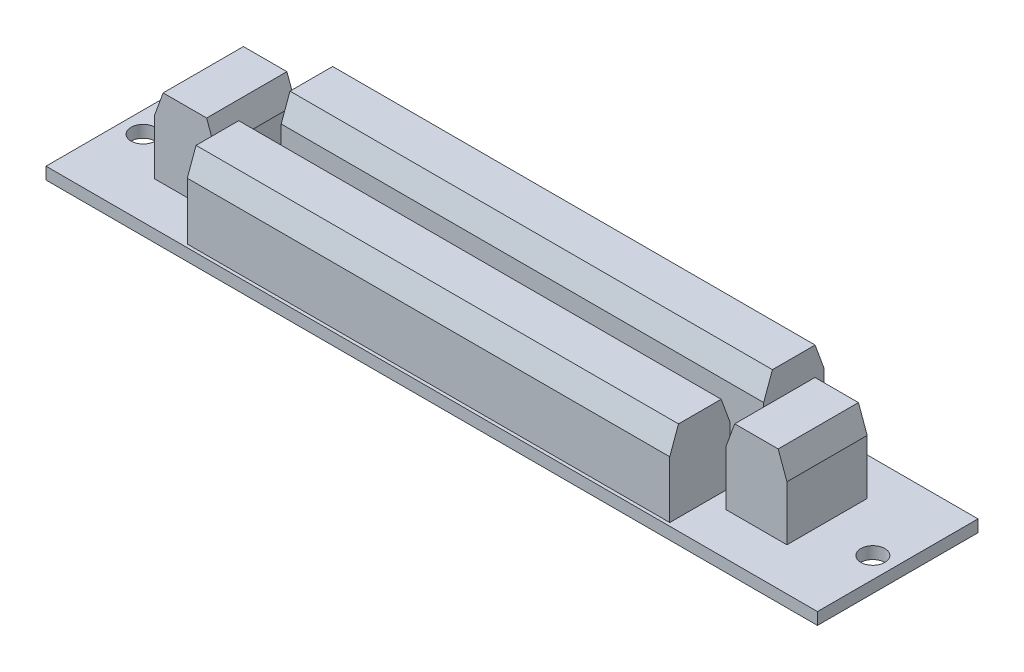
ISO-10303-21;
HEADER;
FILE_DESCRIPTION(('STEP AP214'),'2;1');
FILE_NAME('part.step','',(''),(''),'','','');
FILE_SCHEMA(('AUTOMOTIVE_DESIGN { 1 0 10303 214 1 1 1 1 }'));
ENDSEC;
DATA;
#1=APPLICATION_CONTEXT('core data for automotive mechanical design processes');
#2=APPLICATION_PROTOCOL_DEFINITION('international standard','automotive_design',2000,#1);
#3=PRODUCT_CONTEXT('',#1,'mechanical');
#4=PRODUCT('Part','Part','',(#3));
#5=PRODUCT_RELATED_PRODUCT_CATEGORY('part','',(#4));
#6=PRODUCT_DEFINITION_FORMATION('','',#4);
#7=PRODUCT_DEFINITION_CONTEXT('part definition',#1,'design');
#8=PRODUCT_DEFINITION('design','',#6,#7);
#9=PRODUCT_DEFINITION_SHAPE('','',#8);
#10=(LENGTH_UNIT() NAMED_UNIT(*) SI_UNIT(.MILLI.,.METRE.));
#11=(NAMED_UNIT(*) PLANE_ANGLE_UNIT() SI_UNIT($,.RADIAN.));
#12=(NAMED_UNIT(*) SI_UNIT($,.STERADIAN.) SOLID_ANGLE_UNIT());
#13=UNCERTAINTY_MEASURE_WITH_UNIT(LENGTH_MEASURE(1.E-05),#10,'distance_accuracy_value','');
#14=(GEOMETRIC_REPRESENTATION_CONTEXT(3) GLOBAL_UNCERTAINTY_ASSIGNED_CONTEXT((#13)) GLOBAL_UNIT_ASSIGNED_CONTEXT((#10,
#11,#12)) REPRESENTATION_CONTEXT('',''));
#15=CARTESIAN_POINT('',(0.,0.,0.));
#16=DIRECTION('',(0.,0.,1.));
#17=DIRECTION('',(1.,0.,0.));
#18=AXIS2_PLACEMENT_3D('',#15,#16,#17);
#19=CARTESIAN_POINT('',(0.,1.5,0.));
#20=DIRECTION('',(0.,-1.,0.));
#21=DIRECTION('',(0.,0.,-1.));
#22=AXIS2_PLACEMENT_3D('',#19,#20,#21);
#23=PLANE('',#22);
#24=DIRECTION('',(0.,0.,1.));
#25=VECTOR('',#24,1.);
#26=CARTESIAN_POINT('',(8.1,1.5,-15.4));
#27=LINE('',#26,#25);
#28=CARTESIAN_POINT('',(8.1,1.5,-15.4));
#29=VERTEX_POINT('',#28);
#30=CARTESIAN_POINT('',(8.1,1.5,-5.4));
#31=VERTEX_POINT('',#30);
#32=EDGE_CURVE('E244',#29,#31,#27,.T.);
#33=ORIENTED_EDGE('',*,*,#32,.F.);
#34=DIRECTION('',(-1.,0.,0.));
#35=VECTOR('',#34,1.);
#36=CARTESIAN_POINT('',(8.1,1.5,-15.4));
#37=LINE('',#36,#35);
#38=CARTESIAN_POINT('',(15.7,1.5,-15.4));
#39=VERTEX_POINT('',#38);
#40=EDGE_CURVE('E263',#39,#29,#37,.T.);
#41=ORIENTED_EDGE('',*,*,#40,.F.);
#42=DIRECTION('',(0.,0.,-1.));
#43=VECTOR('',#42,1.);
#44=CARTESIAN_POINT('',(15.7,1.5,-15.4));
#45=LINE('',#44,#43);
#46=CARTESIAN_POINT('',(15.7,1.5,-5.4));
#47=VERTEX_POINT('',#46);
#48=EDGE_CURVE('E272',#47,#39,#45,.T.);
#49=ORIENTED_EDGE('',*,*,#48,.F.);
#50=DIRECTION('',(1.,0.,0.));
#51=VECTOR('',#50,1.);
#52=CARTESIAN_POINT('',(8.1,1.5,-5.4));
#53=LINE('',#52,#51);
#54=EDGE_CURVE('E269',#31,#47,#53,.T.);
#55=ORIENTED_EDGE('',*,*,#54,.F.);
#56=EDGE_LOOP('',(#33,#41,#49,#55));
#57=FACE_BOUND('',#56,.T.);
#58=DIRECTION('',(-1.,0.,0.));
#59=VECTOR('',#58,1.);
#60=CARTESIAN_POINT('',(17.2,1.5,-12.1));
#61=LINE('',#60,#59);
#62=CARTESIAN_POINT('',(77.3,1.5,-12.1));
#63=VERTEX_POINT('',#62);
#64=CARTESIAN_POINT('',(17.2,1.5,-12.1));
#65=VERTEX_POINT('',#64);
#66=EDGE_CURVE('E295',#63,#65,#61,.T.);
#67=ORIENTED_EDGE('',*,*,#66,.T.);
#68=DIRECTION('',(0.,0.,-1.));
#69=VECTOR('',#68,1.);
#70=CARTESIAN_POINT('',(17.2,1.5,-12.1));
#71=LINE('',#70,#69);
#72=CARTESIAN_POINT('',(17.2,1.5,-19.6));
#73=VERTEX_POINT('',#72);
#74=EDGE_CURVE('E284',#65,#73,#71,.T.);
#75=ORIENTED_EDGE('',*,*,#74,.T.);
#76=DIRECTION('',(1.,0.,0.));
#77=VECTOR('',#76,1.);
#78=CARTESIAN_POINT('',(17.2,1.5,-19.6));
#79=LINE('',#78,#77);
#80=CARTESIAN_POINT('',(77.3,1.5,-19.6));
#81=VERTEX_POINT('',#80);
#82=EDGE_CURVE('E289',#73,#81,#79,.T.);
#83=ORIENTED_EDGE('',*,*,#82,.T.);
#84=DIRECTION('',(0.,0.,1.));
#85=VECTOR('',#84,1.);
#86=CARTESIAN_POINT('',(77.3,1.5,-12.1));
#87=LINE('',#86,#85);
#88=EDGE_CURVE('E298',#81,#63,#87,.T.);
#89=ORIENTED_EDGE('',*,*,#88,.T.);
#90=EDGE_LOOP('',(#67,#75,#83,#89));
#91=FACE_BOUND('',#90,.T.);
#92=CARTESIAN_POINT('',(93.5,1.5,-9.5));
#93=DIRECTION('',(0.,1.,0.));
#94=DIRECTION('',(0.,0.,1.));
#95=AXIS2_PLACEMENT_3D('',#92,#93,#94);
#96=CIRCLE('',#95,1.5);
#97=CARTESIAN_POINT('',(93.5,1.5,-8.));
#98=VERTEX_POINT('',#97);
#99=EDGE_CURVE('E337',#98,#98,#96,.T.);
#100=ORIENTED_EDGE('',*,*,#99,.F.);
#101=EDGE_LOOP('',(#100));
#102=FACE_BOUND('',#101,.T.);
#103=CARTESIAN_POINT('',(2.6,1.5,-9.5));
#104=DIRECTION('',(0.,1.,0.));
#105=DIRECTION('',(0.,0.,1.));
#106=AXIS2_PLACEMENT_3D('',#103,#104,#105);
#107=CIRCLE('',#106,1.5);
#108=CARTESIAN_POINT('',(2.6,1.5,-8.));
#109=VERTEX_POINT('',#108);
#110=EDGE_CURVE('E343',#109,#109,#107,.T.);
#111=ORIENTED_EDGE('',*,*,#110,.F.);
#112=EDGE_LOOP('',(#111));
#113=FACE_BOUND('',#112,.T.);
#114=DIRECTION('',(0.,0.,1.));
#115=VECTOR('',#114,1.);
#116=CARTESIAN_POINT('',(0.,1.5,0.));
#117=LINE('',#116,#115);
#118=CARTESIAN_POINT('',(0.,1.5,-20.));
#119=VERTEX_POINT('',#118);
#120=CARTESIAN_POINT('',(0.,1.5,0.));
#121=VERTEX_POINT('',#120);
#122=EDGE_CURVE('E349',#119,#121,#117,.T.);
#123=ORIENTED_EDGE('',*,*,#122,.T.);
#124=DIRECTION('',(1.,0.,0.));
#125=VECTOR('',#124,1.);
#126=CARTESIAN_POINT('',(0.,1.5,0.));
#127=LINE('',#126,#125);
#128=CARTESIAN_POINT('',(96.1,1.5,0.));
#129=VERTEX_POINT('',#128);
#130=EDGE_CURVE('E352',#121,#129,#127,.T.);
#131=ORIENTED_EDGE('',*,*,#130,.T.);
#132=DIRECTION('',(0.,0.,-1.));
#133=VECTOR('',#132,1.);
#134=CARTESIAN_POINT('',(96.1,1.5,0.));
#135=LINE('',#134,#133);
#136=CARTESIAN_POINT('',(96.1,1.5,-20.));
#137=VERTEX_POINT('',#136);
#138=EDGE_CURVE('E355',#129,#137,#135,.T.);
#139=ORIENTED_EDGE('',*,*,#138,.T.);
#140=DIRECTION('',(-1.,0.,0.));
#141=VECTOR('',#140,1.);
#142=CARTESIAN_POINT('',(0.,1.5,-20.));
#143=LINE('',#142,#141);
#144=EDGE_CURVE('E357',#137,#119,#143,.T.);
#145=ORIENTED_EDGE('',*,*,#144,.T.);
#146=EDGE_LOOP('',(#123,#131,#139,#145));
#147=FACE_BOUND('',#146,.T.);
#148=DIRECTION('',(0.,0.,1.));
#149=VECTOR('',#148,1.);
#150=CARTESIAN_POINT('',(17.2,1.5,-7.9));
#151=LINE('',#150,#149);
#152=CARTESIAN_POINT('',(17.2,1.5,-7.9));
#153=VERTEX_POINT('',#152);
#154=CARTESIAN_POINT('',(17.2,1.5,-0.4));
#155=VERTEX_POINT('',#154);
#156=EDGE_CURVE('E310',#153,#155,#151,.T.);
#157=ORIENTED_EDGE('',*,*,#156,.F.);
#158=DIRECTION('',(-1.,0.,0.));
#159=VECTOR('',#158,1.);
#160=CARTESIAN_POINT('',(17.2,1.5,-7.9));
#161=LINE('',#160,#159);
#162=CARTESIAN_POINT('',(77.3,1.5,-7.9));
#163=VERTEX_POINT('',#162);
#164=EDGE_CURVE('E315',#163,#153,#161,.T.);
#165=ORIENTED_EDGE('',*,*,#164,.F.);
#166=DIRECTION('',(0.,0.,-1.));
#167=VECTOR('',#166,1.);
#168=CARTESIAN_POINT('',(77.3,1.5,-7.9));
#169=LINE('',#168,#167);
#170=CARTESIAN_POINT('',(77.3,1.5,-0.4));
#171=VERTEX_POINT('',#170);
#172=EDGE_CURVE('E324',#171,#163,#169,.T.);
#173=ORIENTED_EDGE('',*,*,#172,.F.);
#174=DIRECTION('',(1.,0.,0.));
#175=VECTOR('',#174,1.);
#176=CARTESIAN_POINT('',(17.2,1.5,-0.4));
#177=LINE('',#176,#175);
#178=EDGE_CURVE('E321',#155,#171,#177,.T.);
#179=ORIENTED_EDGE('',*,*,#178,.F.);
#180=EDGE_LOOP('',(#157,#165,#173,#179));
#181=FACE_BOUND('',#180,.T.);
#182=DIRECTION('',(0.,0.,1.));
#183=VECTOR('',#182,1.);
#184=CARTESIAN_POINT('',(79.4,1.5,-15.3));
#185=LINE('',#184,#183);
#186=CARTESIAN_POINT('',(79.4,1.5,-15.3));
#187=VERTEX_POINT('',#186);
#188=CARTESIAN_POINT('',(79.4,1.5,-5.3));
#189=VERTEX_POINT('',#188);
#190=EDGE_CURVE('E228',#187,#189,#185,.T.);
#191=ORIENTED_EDGE('',*,*,#190,.F.);
#192=DIRECTION('',(-1.,0.,0.));
#193=VECTOR('',#192,1.);
#194=CARTESIAN_POINT('',(79.4,1.5,-15.3));
#195=LINE('',#194,#193);
#196=CARTESIAN_POINT('',(87.,1.5,-15.3));
#197=VERTEX_POINT('',#196);
#198=EDGE_CURVE('E240',#197,#187,#195,.T.);
#199=ORIENTED_EDGE('',*,*,#198,.F.);
#200=DIRECTION('',(0.,0.,-1.));
#201=VECTOR('',#200,1.);
#202=CARTESIAN_POINT('',(87.,1.5,-15.3));
#203=LINE('',#202,#201);
#204=CARTESIAN_POINT('',(87.,1.5,-5.3));
#205=VERTEX_POINT('',#204);
#206=EDGE_CURVE('E248',#205,#197,#203,.T.);
#207=ORIENTED_EDGE('',*,*,#206,.F.);
#208=DIRECTION('',(1.,0.,0.));
#209=VECTOR('',#208,1.);
#210=CARTESIAN_POINT('',(79.4,1.5,-5.3));
#211=LINE('',#210,#209);
#212=EDGE_CURVE('E243',#189,#205,#211,.T.);
#213=ORIENTED_EDGE('',*,*,#212,.F.);
#214=EDGE_LOOP('',(#191,#199,#207,#213));
#215=FACE_BOUND('',#214,.T.);
#216=ADVANCED_FACE('F39',(#57,#91,#102,#113,#147,#181,#215),#23,.F.);
#217=CARTESIAN_POINT('',(0.,0.,0.));
#218=DIRECTION('',(0.,-1.,0.));
#219=DIRECTION('',(0.,0.,-1.));
#220=AXIS2_PLACEMENT_3D('',#217,#218,#219);
#221=PLANE('',#220);
#222=CARTESIAN_POINT('',(2.6,0.,-9.5));
#223=DIRECTION('',(0.,1.,0.));
#224=DIRECTION('',(0.,0.,1.));
#225=AXIS2_PLACEMENT_3D('',#222,#223,#224);
#226=CIRCLE('',#225,1.5);
#227=CARTESIAN_POINT('',(2.6,0.,-8.));
#228=VERTEX_POINT('',#227);
#229=EDGE_CURVE('E340',#228,#228,#226,.T.);
#230=ORIENTED_EDGE('',*,*,#229,.T.);
#231=EDGE_LOOP('',(#230));
#232=FACE_BOUND('',#231,.T.);
#233=DIRECTION('',(0.,0.,1.));
#234=VECTOR('',#233,1.);
#235=CARTESIAN_POINT('',(0.,0.,0.));
#236=LINE('',#235,#234);
#237=CARTESIAN_POINT('',(0.,0.,-20.));
#238=VERTEX_POINT('',#237);
#239=CARTESIAN_POINT('',(0.,0.,0.));
#240=VERTEX_POINT('',#239);
#241=EDGE_CURVE('E346',#238,#240,#236,.T.);
#242=ORIENTED_EDGE('',*,*,#241,.F.);
#243=DIRECTION('',(-1.,0.,0.));
#244=VECTOR('',#243,1.);
#245=CARTESIAN_POINT('',(0.,0.,-20.));
#246=LINE('',#245,#244);
#247=CARTESIAN_POINT('',(96.1,0.,-20.));
#248=VERTEX_POINT('',#247);
#249=EDGE_CURVE('E353',#248,#238,#246,.T.);
#250=ORIENTED_EDGE('',*,*,#249,.F.);
#251=DIRECTION('',(0.,0.,-1.));
#252=VECTOR('',#251,1.);
#253=CARTESIAN_POINT('',(96.1,0.,0.));
#254=LINE('',#253,#252);
#255=CARTESIAN_POINT('',(96.1,0.,0.));
#256=VERTEX_POINT('',#255);
#257=EDGE_CURVE('E364',#256,#248,#254,.T.);
#258=ORIENTED_EDGE('',*,*,#257,.F.);
#259=DIRECTION('',(1.,0.,0.));
#260=VECTOR('',#259,1.);
#261=CARTESIAN_POINT('',(0.,0.,0.));
#262=LINE('',#261,#260);
#263=EDGE_CURVE('E362',#240,#256,#262,.T.);
#264=ORIENTED_EDGE('',*,*,#263,.F.);
#265=EDGE_LOOP('',(#242,#250,#258,#264));
#266=FACE_BOUND('',#265,.T.);
#267=CARTESIAN_POINT('',(93.5,0.,-9.5));
#268=DIRECTION('',(0.,1.,0.));
#269=DIRECTION('',(0.,0.,1.));
#270=AXIS2_PLACEMENT_3D('',#267,#268,#269);
#271=CIRCLE('',#270,1.5);
#272=CARTESIAN_POINT('',(93.5,0.,-8.));
#273=VERTEX_POINT('',#272);
#274=EDGE_CURVE('E336',#273,#273,#271,.T.);
#275=ORIENTED_EDGE('',*,*,#274,.T.);
#276=EDGE_LOOP('',(#275));
#277=FACE_BOUND('',#276,.T.);
#278=ADVANCED_FACE('F463',(#232,#266,#277),#221,.T.);
#279=CARTESIAN_POINT('',(0.,1.5,0.));
#280=DIRECTION('',(1.,0.,0.));
#281=DIRECTION('',(0.,0.,-1.));
#282=AXIS2_PLACEMENT_3D('',#279,#280,#281);
#283=PLANE('',#282);
#284=ORIENTED_EDGE('',*,*,#241,.T.);
#285=DIRECTION('',(0.,-1.,0.));
#286=VECTOR('',#285,1.);
#287=CARTESIAN_POINT('',(0.,1.5,0.));
#288=LINE('',#287,#286);
#289=EDGE_CURVE('E375',#121,#240,#288,.T.);
#290=ORIENTED_EDGE('',*,*,#289,.F.);
#291=ORIENTED_EDGE('',*,*,#122,.F.);
#292=DIRECTION('',(0.,-1.,0.));
#293=VECTOR('',#292,1.);
#294=CARTESIAN_POINT('',(0.,1.5,-20.));
#295=LINE('',#294,#293);
#296=EDGE_CURVE('E359',#119,#238,#295,.T.);
#297=ORIENTED_EDGE('',*,*,#296,.T.);
#298=EDGE_LOOP('',(#284,#290,#291,#297));
#299=FACE_BOUND('',#298,.T.);
#300=ADVANCED_FACE('F469',(#299),#283,.F.);
#301=CARTESIAN_POINT('',(0.,1.5,0.));
#302=DIRECTION('',(0.,0.,-1.));
#303=DIRECTION('',(-1.,0.,0.));
#304=AXIS2_PLACEMENT_3D('',#301,#302,#303);
#305=PLANE('',#304);
#306=ORIENTED_EDGE('',*,*,#263,.T.);
#307=DIRECTION('',(0.,-1.,0.));
#308=VECTOR('',#307,1.);
#309=CARTESIAN_POINT('',(96.1,1.5,0.));
#310=LINE('',#309,#308);
#311=EDGE_CURVE('E372',#129,#256,#310,.T.);
#312=ORIENTED_EDGE('',*,*,#311,.F.);
#313=ORIENTED_EDGE('',*,*,#130,.F.);
#314=ORIENTED_EDGE('',*,*,#289,.T.);
#315=EDGE_LOOP('',(#306,#312,#313,#314));
#316=FACE_BOUND('',#315,.T.);
#317=ADVANCED_FACE('F485',(#316),#305,.F.);
#318=CARTESIAN_POINT('',(96.1,1.5,0.));
#319=DIRECTION('',(-1.,0.,0.));
#320=DIRECTION('',(0.,0.,1.));
#321=AXIS2_PLACEMENT_3D('',#318,#319,#320);
#322=PLANE('',#321);
#323=ORIENTED_EDGE('',*,*,#257,.T.);
#324=DIRECTION('',(0.,-1.,0.));
#325=VECTOR('',#324,1.);
#326=CARTESIAN_POINT('',(96.1,1.5,-20.));
#327=LINE('',#326,#325);
#328=EDGE_CURVE('E369',#137,#248,#327,.T.);
#329=ORIENTED_EDGE('',*,*,#328,.F.);
#330=ORIENTED_EDGE('',*,*,#138,.F.);
#331=ORIENTED_EDGE('',*,*,#311,.T.);
#332=EDGE_LOOP('',(#323,#329,#330,#331));
#333=FACE_BOUND('',#332,.T.);
#334=ADVANCED_FACE('F481',(#333),#322,.F.);
#335=CARTESIAN_POINT('',(0.,1.5,-20.));
#336=DIRECTION('',(0.,0.,1.));
#337=DIRECTION('',(1.,0.,0.));
#338=AXIS2_PLACEMENT_3D('',#335,#336,#337);
#339=PLANE('',#338);
#340=ORIENTED_EDGE('',*,*,#249,.T.);
#341=ORIENTED_EDGE('',*,*,#296,.F.);
#342=ORIENTED_EDGE('',*,*,#144,.F.);
#343=ORIENTED_EDGE('',*,*,#328,.T.);
#344=EDGE_LOOP('',(#340,#341,#342,#343));
#345=FACE_BOUND('',#344,.T.);
#346=ADVANCED_FACE('F478',(#345),#339,.F.);
#347=CARTESIAN_POINT('',(2.6,1.5,-9.5));
#348=DIRECTION('',(0.,-1.,0.));
#349=DIRECTION('',(0.,0.,-1.));
#350=AXIS2_PLACEMENT_3D('',#347,#348,#349);
#351=CYLINDRICAL_SURFACE('',#350,1.5);
#352=ORIENTED_EDGE('',*,*,#110,.T.);
#353=EDGE_LOOP('',(#352));
#354=FACE_BOUND('',#353,.T.);
#355=ORIENTED_EDGE('',*,*,#229,.F.);
#356=EDGE_LOOP('',(#355));
#357=FACE_BOUND('',#356,.T.);
#358=ADVANCED_FACE('F475',(#354,#357),#351,.F.);
#359=CARTESIAN_POINT('',(93.5,1.5,-9.5));
#360=DIRECTION('',(0.,-1.,0.));
#361=DIRECTION('',(0.,0.,-1.));
#362=AXIS2_PLACEMENT_3D('',#359,#360,#361);
#363=CYLINDRICAL_SURFACE('',#362,1.5);
#364=ORIENTED_EDGE('',*,*,#99,.T.);
#365=EDGE_LOOP('',(#364));
#366=FACE_BOUND('',#365,.T.);
#367=ORIENTED_EDGE('',*,*,#274,.F.);
#368=EDGE_LOOP('',(#367));
#369=FACE_BOUND('',#368,.T.);
#370=ADVANCED_FACE('F611',(#366,#369),#363,.F.);
#371=CARTESIAN_POINT('',(17.2,11.6,-7.9));
#372=DIRECTION('',(1.,0.,0.));
#373=DIRECTION('',(0.,0.,-1.));
#374=AXIS2_PLACEMENT_3D('',#371,#372,#373);
#375=PLANE('',#374);
#376=DIRECTION('',(0.,0.,1.));
#377=VECTOR('',#376,1.);
#378=CARTESIAN_POINT('',(17.2,11.6,-7.9));
#379=LINE('',#378,#377);
#380=CARTESIAN_POINT('',(17.2,11.6,-6.80808929720139));
#381=VERTEX_POINT('',#380);
#382=CARTESIAN_POINT('',(17.2,11.6,-1.49191070279861));
#383=VERTEX_POINT('',#382);
#384=EDGE_CURVE('E311',#381,#383,#379,.T.);
#385=ORIENTED_EDGE('',*,*,#384,.F.);
#386=DIRECTION('',(0.,-0.93969262078591,-0.342020143325665));
#387=VECTOR('',#386,1.);
#388=CARTESIAN_POINT('',(17.2,11.6,-6.80808929720139));
#389=LINE('',#388,#387);
#390=CARTESIAN_POINT('',(17.2,8.59999999999997,-7.9));
#391=VERTEX_POINT('',#390);
#392=EDGE_CURVE('E386',#381,#391,#389,.T.);
#393=ORIENTED_EDGE('',*,*,#392,.T.);
#394=DIRECTION('',(0.,-1.,0.));
#395=VECTOR('',#394,1.);
#396=CARTESIAN_POINT('',(17.2,11.6,-7.9));
#397=LINE('',#396,#395);
#398=EDGE_CURVE('E318',#391,#153,#397,.T.);
#399=ORIENTED_EDGE('',*,*,#398,.T.);
#400=ORIENTED_EDGE('',*,*,#156,.T.);
#401=DIRECTION('',(0.,-1.,0.));
#402=VECTOR('',#401,1.);
#403=CARTESIAN_POINT('',(17.2,11.6,-0.4));
#404=LINE('',#403,#402);
#405=CARTESIAN_POINT('',(17.2,8.59999999999996,-0.4));
#406=VERTEX_POINT('',#405);
#407=EDGE_CURVE('E334',#406,#155,#404,.T.);
#408=ORIENTED_EDGE('',*,*,#407,.F.);
#409=DIRECTION('',(0.,0.93969262078591,-0.342020143325666));
#410=VECTOR('',#409,1.);
#411=CARTESIAN_POINT('',(17.2,11.6,-1.49191070279861));
#412=LINE('',#411,#410);
#413=EDGE_CURVE('E384',#406,#383,#412,.T.);
#414=ORIENTED_EDGE('',*,*,#413,.T.);
#415=EDGE_LOOP('',(#385,#393,#399,#400,#408,#414));
#416=FACE_BOUND('',#415,.T.);
#417=ADVANCED_FACE('F608',(#416),#375,.F.);
#418=CARTESIAN_POINT('',(17.2,11.6,-0.4));
#419=DIRECTION('',(0.,0.,-1.));
#420=DIRECTION('',(-1.,0.,0.));
#421=AXIS2_PLACEMENT_3D('',#418,#419,#420);
#422=PLANE('',#421);
#423=DIRECTION('',(0.,-1.,0.));
#424=VECTOR('',#423,1.);
#425=CARTESIAN_POINT('',(77.3,11.6,-0.4));
#426=LINE('',#425,#424);
#427=CARTESIAN_POINT('',(77.3,8.59999999999996,-0.4));
#428=VERTEX_POINT('',#427);
#429=EDGE_CURVE('E332',#428,#171,#426,.T.);
#430=ORIENTED_EDGE('',*,*,#429,.F.);
#431=DIRECTION('',(-1.,0.,0.));
#432=VECTOR('',#431,1.);
#433=CARTESIAN_POINT('',(17.2,8.59999999999996,-0.4));
#434=LINE('',#433,#432);
#435=EDGE_CURVE('E394',#428,#406,#434,.T.);
#436=ORIENTED_EDGE('',*,*,#435,.T.);
#437=ORIENTED_EDGE('',*,*,#407,.T.);
#438=ORIENTED_EDGE('',*,*,#178,.T.);
#439=EDGE_LOOP('',(#430,#436,#437,#438));
#440=FACE_BOUND('',#439,.T.);
#441=ADVANCED_FACE('F604',(#440),#422,.F.);
#442=CARTESIAN_POINT('',(77.3,11.6,-7.9));
#443=DIRECTION('',(-1.,0.,0.));
#444=DIRECTION('',(0.,0.,1.));
#445=AXIS2_PLACEMENT_3D('',#442,#443,#444);
#446=PLANE('',#445);
#447=DIRECTION('',(0.,-1.,0.));
#448=VECTOR('',#447,1.);
#449=CARTESIAN_POINT('',(77.3,11.6,-7.9));
#450=LINE('',#449,#448);
#451=CARTESIAN_POINT('',(77.3,8.59999999999997,-7.9));
#452=VERTEX_POINT('',#451);
#453=EDGE_CURVE('E330',#452,#163,#450,.T.);
#454=ORIENTED_EDGE('',*,*,#453,.F.);
#455=DIRECTION('',(0.,0.93969262078591,0.342020143325665));
#456=VECTOR('',#455,1.);
#457=CARTESIAN_POINT('',(77.3,11.6,-6.80808929720139));
#458=LINE('',#457,#456);
#459=CARTESIAN_POINT('',(77.3,11.6,-6.80808929720139));
#460=VERTEX_POINT('',#459);
#461=EDGE_CURVE('E392',#452,#460,#458,.T.);
#462=ORIENTED_EDGE('',*,*,#461,.T.);
#463=DIRECTION('',(0.,0.,-1.));
#464=VECTOR('',#463,1.);
#465=CARTESIAN_POINT('',(77.3,11.6,-7.9));
#466=LINE('',#465,#464);
#467=CARTESIAN_POINT('',(77.3,11.6,-1.49191070279861));
#468=VERTEX_POINT('',#467);
#469=EDGE_CURVE('E314',#468,#460,#466,.T.);
#470=ORIENTED_EDGE('',*,*,#469,.F.);
#471=DIRECTION('',(0.,-0.93969262078591,0.342020143325666));
#472=VECTOR('',#471,1.);
#473=CARTESIAN_POINT('',(77.3,11.6,-1.49191070279861));
#474=LINE('',#473,#472);
#475=EDGE_CURVE('E390',#468,#428,#474,.T.);
#476=ORIENTED_EDGE('',*,*,#475,.T.);
#477=ORIENTED_EDGE('',*,*,#429,.T.);
#478=ORIENTED_EDGE('',*,*,#172,.T.);
#479=EDGE_LOOP('',(#454,#462,#470,#476,#477,#478));
#480=FACE_BOUND('',#479,.T.);
#481=ADVANCED_FACE('F600',(#480),#446,.F.);
#482=CARTESIAN_POINT('',(17.2,11.6,-7.9));
#483=DIRECTION('',(0.,0.,1.));
#484=DIRECTION('',(1.,0.,0.));
#485=AXIS2_PLACEMENT_3D('',#482,#483,#484);
#486=PLANE('',#485);
#487=ORIENTED_EDGE('',*,*,#398,.F.);
#488=DIRECTION('',(1.,0.,0.));
#489=VECTOR('',#488,1.);
#490=CARTESIAN_POINT('',(77.3,8.59999999999997,-7.9));
#491=LINE('',#490,#489);
#492=EDGE_CURVE('E388',#391,#452,#491,.T.);
#493=ORIENTED_EDGE('',*,*,#492,.T.);
#494=ORIENTED_EDGE('',*,*,#453,.T.);
#495=ORIENTED_EDGE('',*,*,#164,.T.);
#496=EDGE_LOOP('',(#487,#493,#494,#495));
#497=FACE_BOUND('',#496,.T.);
#498=ADVANCED_FACE('F596',(#497),#486,.F.);
#499=CARTESIAN_POINT('',(0.,11.6,0.));
#500=DIRECTION('',(0.,1.,0.));
#501=DIRECTION('',(0.,0.,1.));
#502=AXIS2_PLACEMENT_3D('',#499,#500,#501);
#503=PLANE('',#502);
#504=ORIENTED_EDGE('',*,*,#469,.T.);
#505=DIRECTION('',(-1.,0.,0.));
#506=VECTOR('',#505,1.);
#507=CARTESIAN_POINT('',(17.2,11.6,-6.80808929720139));
#508=LINE('',#507,#506);
#509=EDGE_CURVE('E381',#460,#381,#508,.T.);
#510=ORIENTED_EDGE('',*,*,#509,.T.);
#511=ORIENTED_EDGE('',*,*,#384,.T.);
#512=DIRECTION('',(1.,0.,0.));
#513=VECTOR('',#512,1.);
#514=CARTESIAN_POINT('',(77.3,11.6,-1.49191070279861));
#515=LINE('',#514,#513);
#516=EDGE_CURVE('E378',#383,#468,#515,.T.);
#517=ORIENTED_EDGE('',*,*,#516,.T.);
#518=EDGE_LOOP('',(#504,#510,#511,#517));
#519=FACE_BOUND('',#518,.T.);
#520=ADVANCED_FACE('F501',(#519),#503,.T.);
#521=CARTESIAN_POINT('',(0.,11.6,-6.80808929720139));
#522=DIRECTION('',(0.,0.342020143325665,-0.93969262078591));
#523=DIRECTION('',(1.,0.,0.));
#524=AXIS2_PLACEMENT_3D('',#521,#522,#523);
#525=PLANE('',#524);
#526=ORIENTED_EDGE('',*,*,#461,.F.);
#527=ORIENTED_EDGE('',*,*,#492,.F.);
#528=ORIENTED_EDGE('',*,*,#392,.F.);
#529=ORIENTED_EDGE('',*,*,#509,.F.);
#530=EDGE_LOOP('',(#526,#527,#528,#529));
#531=FACE_BOUND('',#530,.T.);
#532=ADVANCED_FACE('F494',(#531),#525,.T.);
#533=CARTESIAN_POINT('',(0.,11.6,-1.49191070279861));
#534=DIRECTION('',(0.,0.342020143325666,0.939692620785909));
#535=DIRECTION('',(-1.,0.,0.));
#536=AXIS2_PLACEMENT_3D('',#533,#534,#535);
#537=PLANE('',#536);
#538=ORIENTED_EDGE('',*,*,#413,.F.);
#539=ORIENTED_EDGE('',*,*,#435,.F.);
#540=ORIENTED_EDGE('',*,*,#475,.F.);
#541=ORIENTED_EDGE('',*,*,#516,.F.);
#542=EDGE_LOOP('',(#538,#539,#540,#541));
#543=FACE_BOUND('',#542,.T.);
#544=ADVANCED_FACE('F500',(#543),#537,.T.);
#545=CARTESIAN_POINT('',(17.2,11.6,-12.1));
#546=DIRECTION('',(-1.,0.,0.));
#547=DIRECTION('',(0.,0.,1.));
#548=AXIS2_PLACEMENT_3D('',#545,#546,#547);
#549=PLANE('',#548);
#550=DIRECTION('',(0.,-1.,0.));
#551=VECTOR('',#550,1.);
#552=CARTESIAN_POINT('',(17.2,11.6,-12.1));
#553=LINE('',#552,#551);
#554=CARTESIAN_POINT('',(17.2,8.59999999999997,-12.1));
#555=VERTEX_POINT('',#554);
#556=EDGE_CURVE('E308',#555,#65,#553,.T.);
#557=ORIENTED_EDGE('',*,*,#556,.F.);
#558=DIRECTION('',(0.,-0.93969262078591,0.342020143325665));
#559=VECTOR('',#558,1.);
#560=CARTESIAN_POINT('',(17.2,11.2490666646785,-13.0641814145298));
#561=LINE('',#560,#559);
#562=CARTESIAN_POINT('',(17.2,11.6,-13.1919107027986));
#563=VERTEX_POINT('',#562);
#564=EDGE_CURVE('E401',#555,#563,#561,.F.);
#565=ORIENTED_EDGE('',*,*,#564,.T.);
#566=DIRECTION('',(0.,0.,-1.));
#567=VECTOR('',#566,1.);
#568=CARTESIAN_POINT('',(17.2,11.6,-12.1));
#569=LINE('',#568,#567);
#570=CARTESIAN_POINT('',(17.2,11.6,-18.5080892972014));
#571=VERTEX_POINT('',#570);
#572=EDGE_CURVE('E285',#563,#571,#569,.T.);
#573=ORIENTED_EDGE('',*,*,#572,.T.);
#574=DIRECTION('',(0.,0.93969262078591,0.342020143325666));
#575=VECTOR('',#574,1.);
#576=CARTESIAN_POINT('',(17.2,13.659520201003,-17.7584852471664));
#577=LINE('',#576,#575);
#578=CARTESIAN_POINT('',(17.2,8.59999999999996,-19.6));
#579=VERTEX_POINT('',#578);
#580=EDGE_CURVE('E399',#571,#579,#577,.F.);
#581=ORIENTED_EDGE('',*,*,#580,.T.);
#582=DIRECTION('',(0.,-1.,0.));
#583=VECTOR('',#582,1.);
#584=CARTESIAN_POINT('',(17.2,11.6,-19.6));
#585=LINE('',#584,#583);
#586=EDGE_CURVE('E292',#579,#73,#585,.T.);
#587=ORIENTED_EDGE('',*,*,#586,.T.);
#588=ORIENTED_EDGE('',*,*,#74,.F.);
#589=EDGE_LOOP('',(#557,#565,#573,#581,#587,#588));
#590=FACE_BOUND('',#589,.T.);
#591=ADVANCED_FACE('F508',(#590),#549,.T.);
#592=CARTESIAN_POINT('',(17.2,11.6,-12.1));
#593=DIRECTION('',(0.,0.,1.));
#594=DIRECTION('',(1.,0.,0.));
#595=AXIS2_PLACEMENT_3D('',#592,#593,#594);
#596=PLANE('',#595);
#597=DIRECTION('',(0.,-1.,0.));
#598=VECTOR('',#597,1.);
#599=CARTESIAN_POINT('',(77.3,11.6,-12.1));
#600=LINE('',#599,#598);
#601=CARTESIAN_POINT('',(77.3,8.59999999999997,-12.1));
#602=VERTEX_POINT('',#601);
#603=EDGE_CURVE('E306',#602,#63,#600,.T.);
#604=ORIENTED_EDGE('',*,*,#603,.F.);
#605=DIRECTION('',(-1.,0.,0.));
#606=VECTOR('',#605,1.);
#607=CARTESIAN_POINT('',(17.2,8.59999999999997,-12.1));
#608=LINE('',#607,#606);
#609=EDGE_CURVE('E396',#602,#555,#608,.T.);
#610=ORIENTED_EDGE('',*,*,#609,.T.);
#611=ORIENTED_EDGE('',*,*,#556,.T.);
#612=ORIENTED_EDGE('',*,*,#66,.F.);
#613=EDGE_LOOP('',(#604,#610,#611,#612));
#614=FACE_BOUND('',#613,.T.);
#615=ADVANCED_FACE('F586',(#614),#596,.T.);
#616=CARTESIAN_POINT('',(77.3,11.6,-12.1));
#617=DIRECTION('',(1.,0.,0.));
#618=DIRECTION('',(0.,0.,-1.));
#619=AXIS2_PLACEMENT_3D('',#616,#617,#618);
#620=PLANE('',#619);
#621=DIRECTION('',(0.,0.,1.));
#622=VECTOR('',#621,1.);
#623=CARTESIAN_POINT('',(77.3,11.6,-12.1));
#624=LINE('',#623,#622);
#625=CARTESIAN_POINT('',(77.3,11.6,-18.5080892972014));
#626=VERTEX_POINT('',#625);
#627=CARTESIAN_POINT('',(77.3,11.6,-13.1919107027986));
#628=VERTEX_POINT('',#627);
#629=EDGE_CURVE('E288',#626,#628,#624,.T.);
#630=ORIENTED_EDGE('',*,*,#629,.T.);
#631=DIRECTION('',(0.,0.93969262078591,-0.342020143325665));
#632=VECTOR('',#631,1.);
#633=CARTESIAN_POINT('',(77.3,11.2490666646785,-13.0641814145298));
#634=LINE('',#633,#632);
#635=EDGE_CURVE('E409',#628,#602,#634,.F.);
#636=ORIENTED_EDGE('',*,*,#635,.T.);
#637=ORIENTED_EDGE('',*,*,#603,.T.);
#638=ORIENTED_EDGE('',*,*,#88,.F.);
#639=DIRECTION('',(0.,-1.,0.));
#640=VECTOR('',#639,1.);
#641=CARTESIAN_POINT('',(77.3,11.6,-19.6));
#642=LINE('',#641,#640);
#643=CARTESIAN_POINT('',(77.3,8.59999999999996,-19.6));
#644=VERTEX_POINT('',#643);
#645=EDGE_CURVE('E304',#644,#81,#642,.T.);
#646=ORIENTED_EDGE('',*,*,#645,.F.);
#647=DIRECTION('',(0.,-0.93969262078591,-0.342020143325666));
#648=VECTOR('',#647,1.);
#649=CARTESIAN_POINT('',(77.3,13.659520201003,-17.7584852471664));
#650=LINE('',#649,#648);
#651=EDGE_CURVE('E407',#644,#626,#650,.F.);
#652=ORIENTED_EDGE('',*,*,#651,.T.);
#653=EDGE_LOOP('',(#630,#636,#637,#638,#646,#652));
#654=FACE_BOUND('',#653,.T.);
#655=ADVANCED_FACE('F582',(#654),#620,.T.);
#656=CARTESIAN_POINT('',(17.2,11.6,-19.6));
#657=DIRECTION('',(0.,0.,-1.));
#658=DIRECTION('',(-1.,0.,0.));
#659=AXIS2_PLACEMENT_3D('',#656,#657,#658);
#660=PLANE('',#659);
#661=ORIENTED_EDGE('',*,*,#586,.F.);
#662=DIRECTION('',(1.,0.,0.));
#663=VECTOR('',#662,1.);
#664=CARTESIAN_POINT('',(17.2,8.59999999999996,-19.6));
#665=LINE('',#664,#663);
#666=EDGE_CURVE('E411',#579,#644,#665,.T.);
#667=ORIENTED_EDGE('',*,*,#666,.T.);
#668=ORIENTED_EDGE('',*,*,#645,.T.);
#669=ORIENTED_EDGE('',*,*,#82,.F.);
#670=EDGE_LOOP('',(#661,#667,#668,#669));
#671=FACE_BOUND('',#670,.T.);
#672=ADVANCED_FACE('F578',(#671),#660,.T.);
#673=CARTESIAN_POINT('',(0.,11.6,-20.));
#674=DIRECTION('',(0.,1.,0.));
#675=DIRECTION('',(0.,0.,-1.));
#676=AXIS2_PLACEMENT_3D('',#673,#674,#675);
#677=PLANE('',#676);
#678=ORIENTED_EDGE('',*,*,#572,.F.);
#679=DIRECTION('',(1.,0.,0.));
#680=VECTOR('',#679,1.);
#681=CARTESIAN_POINT('',(0.,11.6,-13.1919107027986));
#682=LINE('',#681,#680);
#683=EDGE_CURVE('E405',#563,#628,#682,.T.);
#684=ORIENTED_EDGE('',*,*,#683,.T.);
#685=ORIENTED_EDGE('',*,*,#629,.F.);
#686=DIRECTION('',(-1.,0.,0.));
#687=VECTOR('',#686,1.);
#688=CARTESIAN_POINT('',(0.,11.6,-18.5080892972014));
#689=LINE('',#688,#687);
#690=EDGE_CURVE('E403',#626,#571,#689,.T.);
#691=ORIENTED_EDGE('',*,*,#690,.T.);
#692=EDGE_LOOP('',(#678,#684,#685,#691));
#693=FACE_BOUND('',#692,.T.);
#694=ADVANCED_FACE('F517',(#693),#677,.T.);
#695=CARTESIAN_POINT('',(17.2,8.59999999999997,-12.1));
#696=DIRECTION('',(0.,-0.342020143325665,-0.93969262078591));
#697=DIRECTION('',(-1.,0.,0.));
#698=AXIS2_PLACEMENT_3D('',#695,#696,#697);
#699=PLANE('',#698);
#700=ORIENTED_EDGE('',*,*,#635,.F.);
#701=ORIENTED_EDGE('',*,*,#683,.F.);
#702=ORIENTED_EDGE('',*,*,#564,.F.);
#703=ORIENTED_EDGE('',*,*,#609,.F.);
#704=EDGE_LOOP('',(#700,#701,#702,#703));
#705=FACE_BOUND('',#704,.T.);
#706=ADVANCED_FACE('F510',(#705),#699,.F.);
#707=CARTESIAN_POINT('',(17.2,8.59999999999996,-19.6));
#708=DIRECTION('',(0.,-0.342020143325666,0.939692620785909));
#709=DIRECTION('',(1.,0.,0.));
#710=AXIS2_PLACEMENT_3D('',#707,#708,#709);
#711=PLANE('',#710);
#712=ORIENTED_EDGE('',*,*,#580,.F.);
#713=ORIENTED_EDGE('',*,*,#690,.F.);
#714=ORIENTED_EDGE('',*,*,#651,.F.);
#715=ORIENTED_EDGE('',*,*,#666,.F.);
#716=EDGE_LOOP('',(#712,#713,#714,#715));
#717=FACE_BOUND('',#716,.T.);
#718=ADVANCED_FACE('F516',(#717),#711,.F.);
#719=CARTESIAN_POINT('',(8.1,11.3,-15.4));
#720=DIRECTION('',(1.,0.,0.));
#721=DIRECTION('',(0.,0.,-1.));
#722=AXIS2_PLACEMENT_3D('',#719,#720,#721);
#723=PLANE('',#722);
#724=DIRECTION('',(0.,-1.,0.));
#725=VECTOR('',#724,1.);
#726=CARTESIAN_POINT('',(8.1,11.3,-5.4));
#727=LINE('',#726,#725);
#728=CARTESIAN_POINT('',(8.1,8.29999999999997,-5.4));
#729=VERTEX_POINT('',#728);
#730=EDGE_CURVE('E282',#729,#31,#727,.T.);
#731=ORIENTED_EDGE('',*,*,#730,.F.);
#732=DIRECTION('',(0.,0.,-1.));
#733=VECTOR('',#732,1.);
#734=CARTESIAN_POINT('',(8.1,8.29999999999997,-15.4));
#735=LINE('',#734,#733);
#736=CARTESIAN_POINT('',(8.1,8.29999999999997,-15.4));
#737=VERTEX_POINT('',#736);
#738=EDGE_CURVE('E430',#729,#737,#735,.T.);
#739=ORIENTED_EDGE('',*,*,#738,.T.);
#740=DIRECTION('',(0.,-1.,0.));
#741=VECTOR('',#740,1.);
#742=CARTESIAN_POINT('',(8.1,11.3,-15.4));
#743=LINE('',#742,#741);
#744=EDGE_CURVE('E266',#737,#29,#743,.T.);
#745=ORIENTED_EDGE('',*,*,#744,.T.);
#746=ORIENTED_EDGE('',*,*,#32,.T.);
#747=EDGE_LOOP('',(#731,#739,#745,#746));
#748=FACE_BOUND('',#747,.T.);
#749=ADVANCED_FACE('F524',(#748),#723,.F.);
#750=CARTESIAN_POINT('',(8.1,11.3,-5.4));
#751=DIRECTION('',(0.,0.,-1.));
#752=DIRECTION('',(-1.,0.,0.));
#753=AXIS2_PLACEMENT_3D('',#750,#751,#752);
#754=PLANE('',#753);
#755=DIRECTION('',(0.,-1.,0.));
#756=VECTOR('',#755,1.);
#757=CARTESIAN_POINT('',(15.7,11.3,-5.4));
#758=LINE('',#757,#756);
#759=CARTESIAN_POINT('',(15.7,8.29999999999997,-5.4));
#760=VERTEX_POINT('',#759);
#761=EDGE_CURVE('E280',#760,#47,#758,.T.);
#762=ORIENTED_EDGE('',*,*,#761,.F.);
#763=DIRECTION('',(-0.342020143325665,0.93969262078591,0.));
#764=VECTOR('',#763,1.);
#765=CARTESIAN_POINT('',(14.6080892972014,11.3,-5.4));
#766=LINE('',#765,#764);
#767=CARTESIAN_POINT('',(14.6080892972014,11.3,-5.4));
#768=VERTEX_POINT('',#767);
#769=EDGE_CURVE('E428',#760,#768,#766,.T.);
#770=ORIENTED_EDGE('',*,*,#769,.T.);
#771=DIRECTION('',(1.,0.,0.));
#772=VECTOR('',#771,1.);
#773=CARTESIAN_POINT('',(8.1,11.3,-5.4));
#774=LINE('',#773,#772);
#775=CARTESIAN_POINT('',(9.19191070279861,11.3,-5.4));
#776=VERTEX_POINT('',#775);
#777=EDGE_CURVE('E259',#776,#768,#774,.T.);
#778=ORIENTED_EDGE('',*,*,#777,.F.);
#779=DIRECTION('',(-0.342020143325665,-0.93969262078591,0.));
#780=VECTOR('',#779,1.);
#781=CARTESIAN_POINT('',(9.19191070279861,11.3,-5.4));
#782=LINE('',#781,#780);
#783=EDGE_CURVE('E426',#776,#729,#782,.T.);
#784=ORIENTED_EDGE('',*,*,#783,.T.);
#785=ORIENTED_EDGE('',*,*,#730,.T.);
#786=ORIENTED_EDGE('',*,*,#54,.T.);
#787=EDGE_LOOP('',(#762,#770,#778,#784,#785,#786));
#788=FACE_BOUND('',#787,.T.);
#789=ADVANCED_FACE('F565',(#788),#754,.F.);
#790=CARTESIAN_POINT('',(15.7,11.3,-15.4));
#791=DIRECTION('',(-1.,0.,0.));
#792=DIRECTION('',(0.,0.,1.));
#793=AXIS2_PLACEMENT_3D('',#790,#791,#792);
#794=PLANE('',#793);
#795=DIRECTION('',(0.,-1.,0.));
#796=VECTOR('',#795,1.);
#797=CARTESIAN_POINT('',(15.7,11.3,-15.4));
#798=LINE('',#797,#796);
#799=CARTESIAN_POINT('',(15.7,8.29999999999997,-15.4));
#800=VERTEX_POINT('',#799);
#801=EDGE_CURVE('E278',#800,#39,#798,.T.);
#802=ORIENTED_EDGE('',*,*,#801,.F.);
#803=DIRECTION('',(0.,0.,1.));
#804=VECTOR('',#803,1.);
#805=CARTESIAN_POINT('',(15.7,8.29999999999997,-5.4));
#806=LINE('',#805,#804);
#807=EDGE_CURVE('E424',#800,#760,#806,.T.);
#808=ORIENTED_EDGE('',*,*,#807,.T.);
#809=ORIENTED_EDGE('',*,*,#761,.T.);
#810=ORIENTED_EDGE('',*,*,#48,.T.);
#811=EDGE_LOOP('',(#802,#808,#809,#810));
#812=FACE_BOUND('',#811,.T.);
#813=ADVANCED_FACE('F560',(#812),#794,.F.);
#814=CARTESIAN_POINT('',(8.1,11.3,-15.4));
#815=DIRECTION('',(0.,0.,1.));
#816=DIRECTION('',(1.,0.,0.));
#817=AXIS2_PLACEMENT_3D('',#814,#815,#816);
#818=PLANE('',#817);
#819=DIRECTION('',(-1.,0.,0.));
#820=VECTOR('',#819,1.);
#821=CARTESIAN_POINT('',(8.1,11.3,-15.4));
#822=LINE('',#821,#820);
#823=CARTESIAN_POINT('',(14.6080892972014,11.3,-15.4));
#824=VERTEX_POINT('',#823);
#825=CARTESIAN_POINT('',(9.19191070279861,11.3,-15.4));
#826=VERTEX_POINT('',#825);
#827=EDGE_CURVE('E262',#824,#826,#822,.T.);
#828=ORIENTED_EDGE('',*,*,#827,.F.);
#829=DIRECTION('',(0.342020143325665,-0.93969262078591,0.));
#830=VECTOR('',#829,1.);
#831=CARTESIAN_POINT('',(14.6080892972014,11.3,-15.4));
#832=LINE('',#831,#830);
#833=EDGE_CURVE('E422',#824,#800,#832,.T.);
#834=ORIENTED_EDGE('',*,*,#833,.T.);
#835=ORIENTED_EDGE('',*,*,#801,.T.);
#836=ORIENTED_EDGE('',*,*,#40,.T.);
#837=ORIENTED_EDGE('',*,*,#744,.F.);
#838=DIRECTION('',(0.342020143325665,0.93969262078591,0.));
#839=VECTOR('',#838,1.);
#840=CARTESIAN_POINT('',(9.19191070279861,11.3,-15.4));
#841=LINE('',#840,#839);
#842=EDGE_CURVE('E420',#737,#826,#841,.T.);
#843=ORIENTED_EDGE('',*,*,#842,.T.);
#844=EDGE_LOOP('',(#828,#834,#835,#836,#837,#843));
#845=FACE_BOUND('',#844,.T.);
#846=ADVANCED_FACE('F550',(#845),#818,.F.);
#847=CARTESIAN_POINT('',(0.,11.3,0.));
#848=DIRECTION('',(0.,1.,0.));
#849=DIRECTION('',(0.,0.,1.));
#850=AXIS2_PLACEMENT_3D('',#847,#848,#849);
#851=PLANE('',#850);
#852=ORIENTED_EDGE('',*,*,#777,.T.);
#853=DIRECTION('',(0.,0.,-1.));
#854=VECTOR('',#853,1.);
#855=CARTESIAN_POINT('',(14.6080892972014,11.3,-15.4));
#856=LINE('',#855,#854);
#857=EDGE_CURVE('E417',#768,#824,#856,.T.);
#858=ORIENTED_EDGE('',*,*,#857,.T.);
#859=ORIENTED_EDGE('',*,*,#827,.T.);
#860=DIRECTION('',(0.,0.,1.));
#861=VECTOR('',#860,1.);
#862=CARTESIAN_POINT('',(9.19191070279861,11.3,-5.4));
#863=LINE('',#862,#861);
#864=EDGE_CURVE('E414',#826,#776,#863,.T.);
#865=ORIENTED_EDGE('',*,*,#864,.T.);
#866=EDGE_LOOP('',(#852,#858,#859,#865));
#867=FACE_BOUND('',#866,.T.);
#868=ADVANCED_FACE('F552',(#867),#851,.T.);
#869=CARTESIAN_POINT('',(79.4,11.3,-15.3));
#870=DIRECTION('',(1.,0.,0.));
#871=DIRECTION('',(0.,0.,-1.));
#872=AXIS2_PLACEMENT_3D('',#869,#870,#871);
#873=PLANE('',#872);
#874=DIRECTION('',(0.,-1.,0.));
#875=VECTOR('',#874,1.);
#876=CARTESIAN_POINT('',(79.4,11.3,-5.3));
#877=LINE('',#876,#875);
#878=CARTESIAN_POINT('',(79.4,8.29999999999996,-5.3));
#879=VERTEX_POINT('',#878);
#880=EDGE_CURVE('E453',#879,#189,#877,.T.);
#881=ORIENTED_EDGE('',*,*,#880,.F.);
#882=DIRECTION('',(0.,0.,-1.));
#883=VECTOR('',#882,1.);
#884=CARTESIAN_POINT('',(79.4,8.29999999999996,-15.3));
#885=LINE('',#884,#883);
#886=CARTESIAN_POINT('',(79.4,8.29999999999996,-15.3));
#887=VERTEX_POINT('',#886);
#888=EDGE_CURVE('E11',#879,#887,#885,.T.);
#889=ORIENTED_EDGE('',*,*,#888,.T.);
#890=DIRECTION('',(0.,-1.,0.));
#891=VECTOR('',#890,1.);
#892=CARTESIAN_POINT('',(79.4,11.3,-15.3));
#893=LINE('',#892,#891);
#894=EDGE_CURVE('E225',#887,#187,#893,.T.);
#895=ORIENTED_EDGE('',*,*,#894,.T.);
#896=ORIENTED_EDGE('',*,*,#190,.T.);
#897=EDGE_LOOP('',(#881,#889,#895,#896));
#898=FACE_BOUND('',#897,.T.);
#899=ADVANCED_FACE('F227',(#898),#873,.F.);
#900=CARTESIAN_POINT('',(79.4,11.3,-5.3));
#901=DIRECTION('',(0.,0.,-1.));
#902=DIRECTION('',(-1.,0.,0.));
#903=AXIS2_PLACEMENT_3D('',#900,#901,#902);
#904=PLANE('',#903);
#905=DIRECTION('',(0.,-1.,0.));
#906=VECTOR('',#905,1.);
#907=CARTESIAN_POINT('',(87.,11.3,-5.3));
#908=LINE('',#907,#906);
#909=CARTESIAN_POINT('',(87.,8.29999999999994,-5.3));
#910=VERTEX_POINT('',#909);
#911=EDGE_CURVE('E445',#910,#205,#908,.T.);
#912=ORIENTED_EDGE('',*,*,#911,.F.);
#913=DIRECTION('',(-0.342020143325668,0.939692620785909,0.));
#914=VECTOR('',#913,1.);
#915=CARTESIAN_POINT('',(85.9080892972014,11.3,-5.3));
#916=LINE('',#915,#914);
#917=CARTESIAN_POINT('',(85.9080892972014,11.3,-5.3));
#918=VERTEX_POINT('',#917);
#919=EDGE_CURVE('E48',#910,#918,#916,.T.);
#920=ORIENTED_EDGE('',*,*,#919,.T.);
#921=DIRECTION('',(1.,0.,0.));
#922=VECTOR('',#921,1.);
#923=CARTESIAN_POINT('',(79.4,11.3,-5.3));
#924=LINE('',#923,#922);
#925=CARTESIAN_POINT('',(80.4919107027986,11.3,-5.3));
#926=VERTEX_POINT('',#925);
#927=EDGE_CURVE('E249',#926,#918,#924,.T.);
#928=ORIENTED_EDGE('',*,*,#927,.F.);
#929=DIRECTION('',(-0.342020143325666,-0.93969262078591,0.));
#930=VECTOR('',#929,1.);
#931=CARTESIAN_POINT('',(80.4919107027986,11.3,-5.3));
#932=LINE('',#931,#930);
#933=EDGE_CURVE('E55',#926,#879,#932,.T.);
#934=ORIENTED_EDGE('',*,*,#933,.T.);
#935=ORIENTED_EDGE('',*,*,#880,.T.);
#936=ORIENTED_EDGE('',*,*,#212,.T.);
#937=EDGE_LOOP('',(#912,#920,#928,#934,#935,#936));
#938=FACE_BOUND('',#937,.T.);
#939=ADVANCED_FACE('F444',(#938),#904,.F.);
#940=CARTESIAN_POINT('',(87.,11.3,-15.3));
#941=DIRECTION('',(-1.,0.,0.));
#942=DIRECTION('',(0.,0.,1.));
#943=AXIS2_PLACEMENT_3D('',#940,#941,#942);
#944=PLANE('',#943);
#945=DIRECTION('',(0.,-1.,0.));
#946=VECTOR('',#945,1.);
#947=CARTESIAN_POINT('',(87.,11.3,-15.3));
#948=LINE('',#947,#946);
#949=CARTESIAN_POINT('',(87.,8.29999999999994,-15.3));
#950=VERTEX_POINT('',#949);
#951=EDGE_CURVE('E234',#950,#197,#948,.T.);
#952=ORIENTED_EDGE('',*,*,#951,.F.);
#953=DIRECTION('',(0.,0.,1.));
#954=VECTOR('',#953,1.);
#955=CARTESIAN_POINT('',(87.,8.29999999999994,-5.3));
#956=LINE('',#955,#954);
#957=EDGE_CURVE('E63',#950,#910,#956,.T.);
#958=ORIENTED_EDGE('',*,*,#957,.T.);
#959=ORIENTED_EDGE('',*,*,#911,.T.);
#960=ORIENTED_EDGE('',*,*,#206,.T.);
#961=EDGE_LOOP('',(#952,#958,#959,#960));
#962=FACE_BOUND('',#961,.T.);
#963=ADVANCED_FACE('F452',(#962),#944,.F.);
#964=CARTESIAN_POINT('',(79.4,11.3,-15.3));
#965=DIRECTION('',(0.,0.,1.));
#966=DIRECTION('',(1.,0.,0.));
#967=AXIS2_PLACEMENT_3D('',#964,#965,#966);
#968=PLANE('',#967);
#969=DIRECTION('',(-1.,0.,0.));
#970=VECTOR('',#969,1.);
#971=CARTESIAN_POINT('',(79.4,11.3,-15.3));
#972=LINE('',#971,#970);
#973=CARTESIAN_POINT('',(85.9080892972014,11.3,-15.3));
#974=VERTEX_POINT('',#973);
#975=CARTESIAN_POINT('',(80.4919107027986,11.3,-15.3));
#976=VERTEX_POINT('',#975);
#977=EDGE_CURVE('E233',#974,#976,#972,.T.);
#978=ORIENTED_EDGE('',*,*,#977,.F.);
#979=DIRECTION('',(0.342020143325668,-0.939692620785909,0.));
#980=VECTOR('',#979,1.);
#981=CARTESIAN_POINT('',(85.9080892972014,11.3,-15.3));
#982=LINE('',#981,#980);
#983=EDGE_CURVE('E440',#974,#950,#982,.T.);
#984=ORIENTED_EDGE('',*,*,#983,.T.);
#985=ORIENTED_EDGE('',*,*,#951,.T.);
#986=ORIENTED_EDGE('',*,*,#198,.T.);
#987=ORIENTED_EDGE('',*,*,#894,.F.);
#988=DIRECTION('',(0.342020143325666,0.93969262078591,0.));
#989=VECTOR('',#988,1.);
#990=CARTESIAN_POINT('',(80.4919107027986,11.3,-15.3));
#991=LINE('',#990,#989);
#992=EDGE_CURVE('E438',#887,#976,#991,.T.);
#993=ORIENTED_EDGE('',*,*,#992,.T.);
#994=EDGE_LOOP('',(#978,#984,#985,#986,#987,#993));
#995=FACE_BOUND('',#994,.T.);
#996=ADVANCED_FACE('F247',(#995),#968,.F.);
#997=CARTESIAN_POINT('',(0.,11.3,0.));
#998=DIRECTION('',(0.,1.,0.));
#999=DIRECTION('',(0.,0.,1.));
#1000=AXIS2_PLACEMENT_3D('',#997,#998,#999);
#1001=PLANE('',#1000);
#1002=ORIENTED_EDGE('',*,*,#927,.T.);
#1003=DIRECTION('',(0.,0.,-1.));
#1004=VECTOR('',#1003,1.);
#1005=CARTESIAN_POINT('',(85.9080892972014,11.3,-15.3));
#1006=LINE('',#1005,#1004);
#1007=EDGE_CURVE('E435',#918,#974,#1006,.T.);
#1008=ORIENTED_EDGE('',*,*,#1007,.T.);
#1009=ORIENTED_EDGE('',*,*,#977,.T.);
#1010=DIRECTION('',(0.,0.,1.));
#1011=VECTOR('',#1010,1.);
#1012=CARTESIAN_POINT('',(80.4919107027986,11.3,-5.3));
#1013=LINE('',#1012,#1011);
#1014=EDGE_CURVE('E432',#976,#926,#1013,.T.);
#1015=ORIENTED_EDGE('',*,*,#1014,.T.);
#1016=EDGE_LOOP('',(#1002,#1008,#1009,#1015));
#1017=FACE_BOUND('',#1016,.T.);
#1018=ADVANCED_FACE('F449',(#1017),#1001,.T.);
#1019=CARTESIAN_POINT('',(14.6080892972014,11.3,0.));
#1020=DIRECTION('',(0.93969262078591,0.342020143325665,0.));
#1021=DIRECTION('',(0.,0.,1.));
#1022=AXIS2_PLACEMENT_3D('',#1019,#1020,#1021);
#1023=PLANE('',#1022);
#1024=ORIENTED_EDGE('',*,*,#769,.F.);
#1025=ORIENTED_EDGE('',*,*,#807,.F.);
#1026=ORIENTED_EDGE('',*,*,#833,.F.);
#1027=ORIENTED_EDGE('',*,*,#857,.F.);
#1028=EDGE_LOOP('',(#1024,#1025,#1026,#1027));
#1029=FACE_BOUND('',#1028,.T.);
#1030=ADVANCED_FACE('F526',(#1029),#1023,.T.);
#1031=CARTESIAN_POINT('',(9.19191070279861,11.3,0.));
#1032=DIRECTION('',(-0.93969262078591,0.342020143325665,0.));
#1033=DIRECTION('',(0.,0.,-1.));
#1034=AXIS2_PLACEMENT_3D('',#1031,#1032,#1033);
#1035=PLANE('',#1034);
#1036=ORIENTED_EDGE('',*,*,#842,.F.);
#1037=ORIENTED_EDGE('',*,*,#738,.F.);
#1038=ORIENTED_EDGE('',*,*,#783,.F.);
#1039=ORIENTED_EDGE('',*,*,#864,.F.);
#1040=EDGE_LOOP('',(#1036,#1037,#1038,#1039));
#1041=FACE_BOUND('',#1040,.T.);
#1042=ADVANCED_FACE('F461',(#1041),#1035,.T.);
#1043=CARTESIAN_POINT('',(85.9080892972014,11.3,0.));
#1044=DIRECTION('',(0.939692620785909,0.342020143325668,0.));
#1045=DIRECTION('',(0.,0.,1.));
#1046=AXIS2_PLACEMENT_3D('',#1043,#1044,#1045);
#1047=PLANE('',#1046);
#1048=ORIENTED_EDGE('',*,*,#919,.F.);
#1049=ORIENTED_EDGE('',*,*,#957,.F.);
#1050=ORIENTED_EDGE('',*,*,#983,.F.);
#1051=ORIENTED_EDGE('',*,*,#1007,.F.);
#1052=EDGE_LOOP('',(#1048,#1049,#1050,#1051));
#1053=FACE_BOUND('',#1052,.T.);
#1054=ADVANCED_FACE('F451',(#1053),#1047,.T.);
#1055=CARTESIAN_POINT('',(80.4919107027986,11.3,0.));
#1056=DIRECTION('',(-0.939692620785909,0.342020143325666,0.));
#1057=DIRECTION('',(0.,0.,-1.));
#1058=AXIS2_PLACEMENT_3D('',#1055,#1056,#1057);
#1059=PLANE('',#1058);
#1060=ORIENTED_EDGE('',*,*,#992,.F.);
#1061=ORIENTED_EDGE('',*,*,#888,.F.);
#1062=ORIENTED_EDGE('',*,*,#933,.F.);
#1063=ORIENTED_EDGE('',*,*,#1014,.F.);
#1064=EDGE_LOOP('',(#1060,#1061,#1062,#1063));
#1065=FACE_BOUND('',#1064,.T.);
#1066=ADVANCED_FACE('F42',(#1065),#1059,.T.);
#1067=CLOSED_SHELL('',(#216,#278,#300,#317,#334,#346,#358,#370,#417,#441,#481,#498,#520,#532,
#544,#591,#615,#655,#672,#694,#706,#718,#749,#789,#813,#846,#868,#899,#939,#963,#996,#1018,
#1030,#1042,#1054,#1066));
#1068=MANIFOLD_SOLID_BREP('B2',#1067);
#1069=ADVANCED_BREP_SHAPE_REPRESENTATION('',(#18,#1068),#14);
#1070=SHAPE_DEFINITION_REPRESENTATION(#9,#1069);
ENDSEC;
END-ISO-10303-21;
